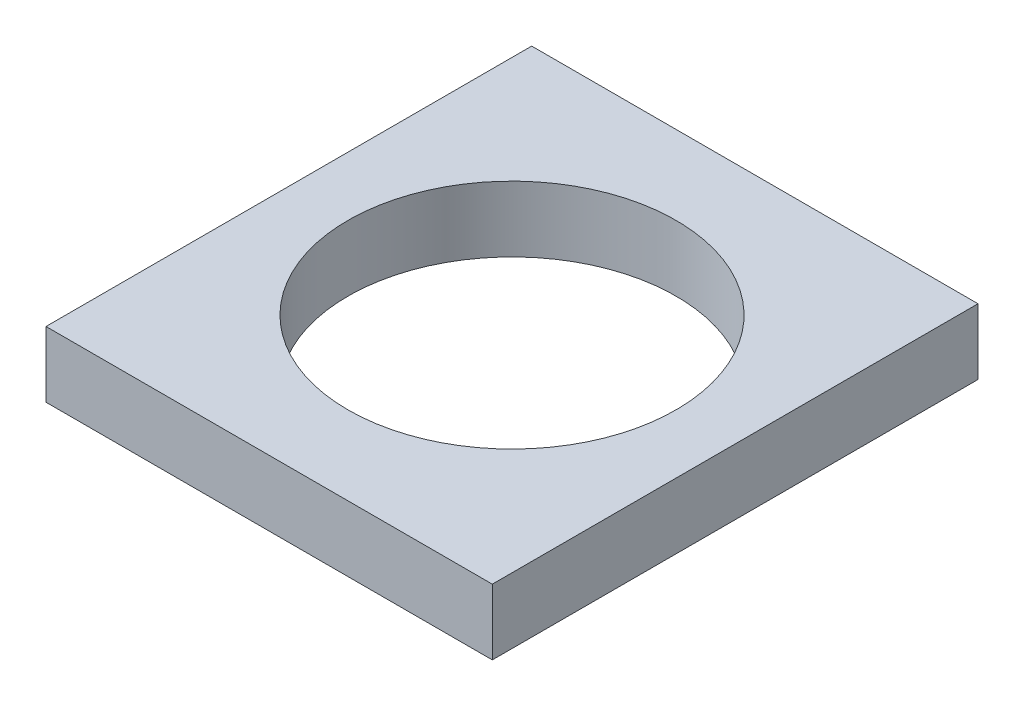
ISO-10303-21;
HEADER;
FILE_DESCRIPTION(('STEP AP214'),'2;1');
FILE_NAME('part.step','',(''),(''),'','','');
FILE_SCHEMA(('AUTOMOTIVE_DESIGN { 1 0 10303 214 1 1 1 1 }'));
ENDSEC;
DATA;
#1=APPLICATION_CONTEXT('core data for automotive mechanical design processes');
#2=APPLICATION_PROTOCOL_DEFINITION('international standard','automotive_design',2000,#1);
#3=PRODUCT_CONTEXT('',#1,'mechanical');
#4=PRODUCT('Part','Part','',(#3));
#5=PRODUCT_RELATED_PRODUCT_CATEGORY('part','',(#4));
#6=PRODUCT_DEFINITION_FORMATION('','',#4);
#7=PRODUCT_DEFINITION_CONTEXT('part definition',#1,'design');
#8=PRODUCT_DEFINITION('design','',#6,#7);
#9=PRODUCT_DEFINITION_SHAPE('','',#8);
#10=(LENGTH_UNIT() NAMED_UNIT(*) SI_UNIT(.MILLI.,.METRE.));
#11=(NAMED_UNIT(*) PLANE_ANGLE_UNIT() SI_UNIT($,.RADIAN.));
#12=(NAMED_UNIT(*) SI_UNIT($,.STERADIAN.) SOLID_ANGLE_UNIT());
#13=UNCERTAINTY_MEASURE_WITH_UNIT(LENGTH_MEASURE(1.E-05),#10,'distance_accuracy_value','');
#14=(GEOMETRIC_REPRESENTATION_CONTEXT(3) GLOBAL_UNCERTAINTY_ASSIGNED_CONTEXT((#13)) GLOBAL_UNIT_ASSIGNED_CONTEXT((#10,
#11,#12)) REPRESENTATION_CONTEXT('',''));
#15=CARTESIAN_POINT('',(0.,0.,0.));
#16=DIRECTION('',(0.,0.,1.));
#17=DIRECTION('',(1.,0.,0.));
#18=AXIS2_PLACEMENT_3D('',#15,#16,#17);
#19=CARTESIAN_POINT('',(17.,-5.,18.5));
#20=DIRECTION('',(1.,0.,0.));
#21=DIRECTION('',(0.,0.,-1.));
#22=AXIS2_PLACEMENT_3D('',#19,#20,#21);
#23=PLANE('',#22);
#24=DIRECTION('',(0.,0.,-1.));
#25=VECTOR('',#24,1.);
#26=CARTESIAN_POINT('',(17.,0.,18.5));
#27=LINE('',#26,#25);
#28=CARTESIAN_POINT('',(17.,0.,18.5));
#29=VERTEX_POINT('',#28);
#30=CARTESIAN_POINT('',(17.,0.,-18.5));
#31=VERTEX_POINT('',#30);
#32=EDGE_CURVE('E100',#29,#31,#27,.T.);
#33=ORIENTED_EDGE('',*,*,#32,.F.);
#34=DIRECTION('',(0.,1.,0.));
#35=VECTOR('',#34,1.);
#36=CARTESIAN_POINT('',(17.,-5.,18.5));
#37=LINE('',#36,#35);
#38=CARTESIAN_POINT('',(17.,-5.,18.5));
#39=VERTEX_POINT('',#38);
#40=EDGE_CURVE('E11',#39,#29,#37,.T.);
#41=ORIENTED_EDGE('',*,*,#40,.F.);
#42=DIRECTION('',(0.,0.,-1.));
#43=VECTOR('',#42,1.);
#44=CARTESIAN_POINT('',(17.,-5.,18.5));
#45=LINE('',#44,#43);
#46=CARTESIAN_POINT('',(17.,-5.,-18.5));
#47=VERTEX_POINT('',#46);
#48=EDGE_CURVE('E93',#39,#47,#45,.T.);
#49=ORIENTED_EDGE('',*,*,#48,.T.);
#50=DIRECTION('',(0.,1.,0.));
#51=VECTOR('',#50,1.);
#52=CARTESIAN_POINT('',(17.,-5.,-18.5));
#53=LINE('',#52,#51);
#54=EDGE_CURVE('E38',#47,#31,#53,.T.);
#55=ORIENTED_EDGE('',*,*,#54,.T.);
#56=EDGE_LOOP('',(#33,#41,#49,#55));
#57=FACE_BOUND('',#56,.T.);
#58=ADVANCED_FACE('F35',(#57),#23,.T.);
#59=CARTESIAN_POINT('',(-17.,-5.,18.5));
#60=DIRECTION('',(0.,0.,1.));
#61=DIRECTION('',(1.,0.,0.));
#62=AXIS2_PLACEMENT_3D('',#59,#60,#61);
#63=PLANE('',#62);
#64=DIRECTION('',(1.,0.,0.));
#65=VECTOR('',#64,1.);
#66=CARTESIAN_POINT('',(-17.,0.,18.5));
#67=LINE('',#66,#65);
#68=CARTESIAN_POINT('',(-17.,0.,18.5));
#69=VERTEX_POINT('',#68);
#70=EDGE_CURVE('E95',#69,#29,#67,.T.);
#71=ORIENTED_EDGE('',*,*,#70,.F.);
#72=DIRECTION('',(0.,1.,0.));
#73=VECTOR('',#72,1.);
#74=CARTESIAN_POINT('',(-17.,-5.,18.5));
#75=LINE('',#74,#73);
#76=CARTESIAN_POINT('',(-17.,-5.,18.5));
#77=VERTEX_POINT('',#76);
#78=EDGE_CURVE('E44',#77,#69,#75,.T.);
#79=ORIENTED_EDGE('',*,*,#78,.F.);
#80=DIRECTION('',(1.,0.,0.));
#81=VECTOR('',#80,1.);
#82=CARTESIAN_POINT('',(-17.,-5.,18.5));
#83=LINE('',#82,#81);
#84=EDGE_CURVE('E90',#77,#39,#83,.T.);
#85=ORIENTED_EDGE('',*,*,#84,.T.);
#86=ORIENTED_EDGE('',*,*,#40,.T.);
#87=EDGE_LOOP('',(#71,#79,#85,#86));
#88=FACE_BOUND('',#87,.T.);
#89=ADVANCED_FACE('F111',(#88),#63,.T.);
#90=CARTESIAN_POINT('',(-17.,-5.,18.5));
#91=DIRECTION('',(-1.,0.,0.));
#92=DIRECTION('',(0.,0.,1.));
#93=AXIS2_PLACEMENT_3D('',#90,#91,#92);
#94=PLANE('',#93);
#95=DIRECTION('',(0.,0.,1.));
#96=VECTOR('',#95,1.);
#97=CARTESIAN_POINT('',(-17.,0.,18.5));
#98=LINE('',#97,#96);
#99=CARTESIAN_POINT('',(-17.,0.,-18.5));
#100=VERTEX_POINT('',#99);
#101=EDGE_CURVE('E85',#100,#69,#98,.T.);
#102=ORIENTED_EDGE('',*,*,#101,.F.);
#103=DIRECTION('',(0.,1.,0.));
#104=VECTOR('',#103,1.);
#105=CARTESIAN_POINT('',(-17.,-5.,-18.5));
#106=LINE('',#105,#104);
#107=CARTESIAN_POINT('',(-17.,-5.,-18.5));
#108=VERTEX_POINT('',#107);
#109=EDGE_CURVE('E80',#108,#100,#106,.T.);
#110=ORIENTED_EDGE('',*,*,#109,.F.);
#111=DIRECTION('',(0.,0.,1.));
#112=VECTOR('',#111,1.);
#113=CARTESIAN_POINT('',(-17.,-5.,18.5));
#114=LINE('',#113,#112);
#115=EDGE_CURVE('E83',#108,#77,#114,.T.);
#116=ORIENTED_EDGE('',*,*,#115,.T.);
#117=ORIENTED_EDGE('',*,*,#78,.T.);
#118=EDGE_LOOP('',(#102,#110,#116,#117));
#119=FACE_BOUND('',#118,.T.);
#120=ADVANCED_FACE('F82',(#119),#94,.T.);
#121=CARTESIAN_POINT('',(-17.,-5.,-18.5));
#122=DIRECTION('',(0.,0.,-1.));
#123=DIRECTION('',(-1.,0.,0.));
#124=AXIS2_PLACEMENT_3D('',#121,#122,#123);
#125=PLANE('',#124);
#126=DIRECTION('',(-1.,0.,0.));
#127=VECTOR('',#126,1.);
#128=CARTESIAN_POINT('',(-17.,0.,-18.5));
#129=LINE('',#128,#127);
#130=EDGE_CURVE('E103',#31,#100,#129,.T.);
#131=ORIENTED_EDGE('',*,*,#130,.F.);
#132=ORIENTED_EDGE('',*,*,#54,.F.);
#133=DIRECTION('',(-1.,0.,0.));
#134=VECTOR('',#133,1.);
#135=CARTESIAN_POINT('',(-17.,-5.,-18.5));
#136=LINE('',#135,#134);
#137=EDGE_CURVE('E89',#47,#108,#136,.T.);
#138=ORIENTED_EDGE('',*,*,#137,.T.);
#139=ORIENTED_EDGE('',*,*,#109,.T.);
#140=EDGE_LOOP('',(#131,#132,#138,#139));
#141=FACE_BOUND('',#140,.T.);
#142=ADVANCED_FACE('F92',(#141),#125,.T.);
#143=CARTESIAN_POINT('',(17.,-5.,-18.5));
#144=DIRECTION('',(0.,-1.,0.));
#145=DIRECTION('',(0.,0.,-1.));
#146=AXIS2_PLACEMENT_3D('',#143,#144,#145);
#147=PLANE('',#146);
#148=CARTESIAN_POINT('',(0.,-5.,0.));
#149=DIRECTION('',(0.,1.,0.));
#150=DIRECTION('',(0.,0.,1.));
#151=AXIS2_PLACEMENT_3D('',#148,#149,#150);
#152=CIRCLE('',#151,12.5);
#153=CARTESIAN_POINT('',(0.,-5.,12.5));
#154=VERTEX_POINT('',#153);
#155=EDGE_CURVE('E104',#154,#154,#152,.T.);
#156=ORIENTED_EDGE('',*,*,#155,.T.);
#157=EDGE_LOOP('',(#156));
#158=FACE_BOUND('',#157,.T.);
#159=ORIENTED_EDGE('',*,*,#48,.F.);
#160=ORIENTED_EDGE('',*,*,#84,.F.);
#161=ORIENTED_EDGE('',*,*,#115,.F.);
#162=ORIENTED_EDGE('',*,*,#137,.F.);
#163=EDGE_LOOP('',(#159,#160,#161,#162));
#164=FACE_BOUND('',#163,.T.);
#165=ADVANCED_FACE('F88',(#158,#164),#147,.T.);
#166=CARTESIAN_POINT('',(17.,0.,-18.5));
#167=DIRECTION('',(0.,-1.,0.));
#168=DIRECTION('',(0.,0.,-1.));
#169=AXIS2_PLACEMENT_3D('',#166,#167,#168);
#170=PLANE('',#169);
#171=CARTESIAN_POINT('',(0.,0.,0.));
#172=DIRECTION('',(0.,1.,0.));
#173=DIRECTION('',(0.,0.,1.));
#174=AXIS2_PLACEMENT_3D('',#171,#172,#173);
#175=CIRCLE('',#174,12.5);
#176=CARTESIAN_POINT('',(0.,0.,12.5));
#177=VERTEX_POINT('',#176);
#178=EDGE_CURVE('E141',#177,#177,#175,.T.);
#179=ORIENTED_EDGE('',*,*,#178,.F.);
#180=EDGE_LOOP('',(#179));
#181=FACE_BOUND('',#180,.T.);
#182=ORIENTED_EDGE('',*,*,#32,.T.);
#183=ORIENTED_EDGE('',*,*,#130,.T.);
#184=ORIENTED_EDGE('',*,*,#101,.T.);
#185=ORIENTED_EDGE('',*,*,#70,.T.);
#186=EDGE_LOOP('',(#182,#183,#184,#185));
#187=FACE_BOUND('',#186,.T.);
#188=ADVANCED_FACE('F110',(#181,#187),#170,.F.);
#189=CARTESIAN_POINT('',(0.,-5.,0.));
#190=DIRECTION('',(0.,1.,0.));
#191=DIRECTION('',(0.,0.,1.));
#192=AXIS2_PLACEMENT_3D('',#189,#190,#191);
#193=CYLINDRICAL_SURFACE('',#192,12.5);
#194=ORIENTED_EDGE('',*,*,#155,.F.);
#195=EDGE_LOOP('',(#194));
#196=FACE_BOUND('',#195,.T.);
#197=ORIENTED_EDGE('',*,*,#178,.T.);
#198=EDGE_LOOP('',(#197));
#199=FACE_BOUND('',#198,.T.);
#200=ADVANCED_FACE('F129',(#196,#199),#193,.F.);
#201=CLOSED_SHELL('',(#58,#89,#120,#142,#165,#188,#200));
#202=MANIFOLD_SOLID_BREP('B2',#201);
#203=ADVANCED_BREP_SHAPE_REPRESENTATION('',(#18,#202),#14);
#204=SHAPE_DEFINITION_REPRESENTATION(#9,#203);
ENDSEC;
END-ISO-10303-21;
